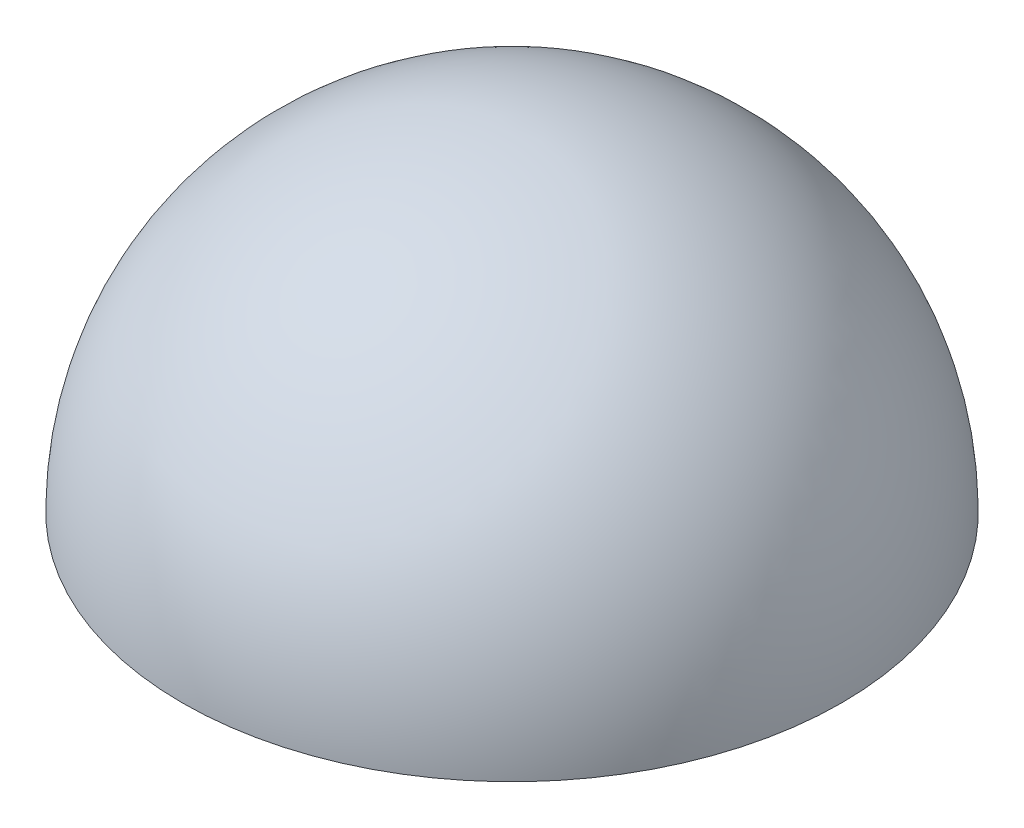
ISO-10303-21;
HEADER;
FILE_DESCRIPTION(('STEP AP214'),'2;1');
FILE_NAME('part.step','',(''),(''),'','','');
FILE_SCHEMA(('AUTOMOTIVE_DESIGN { 1 0 10303 214 1 1 1 1 }'));
ENDSEC;
DATA;
#1=APPLICATION_CONTEXT('core data for automotive mechanical design processes');
#2=APPLICATION_PROTOCOL_DEFINITION('international standard','automotive_design',2000,#1);
#3=PRODUCT_CONTEXT('',#1,'mechanical');
#4=PRODUCT('Part','Part','',(#3));
#5=PRODUCT_RELATED_PRODUCT_CATEGORY('part','',(#4));
#6=PRODUCT_DEFINITION_FORMATION('','',#4);
#7=PRODUCT_DEFINITION_CONTEXT('part definition',#1,'design');
#8=PRODUCT_DEFINITION('design','',#6,#7);
#9=PRODUCT_DEFINITION_SHAPE('','',#8);
#10=(LENGTH_UNIT() NAMED_UNIT(*) SI_UNIT(.MILLI.,.METRE.));
#11=(NAMED_UNIT(*) PLANE_ANGLE_UNIT() SI_UNIT($,.RADIAN.));
#12=(NAMED_UNIT(*) SI_UNIT($,.STERADIAN.) SOLID_ANGLE_UNIT());
#13=UNCERTAINTY_MEASURE_WITH_UNIT(LENGTH_MEASURE(1.E-05),#10,'distance_accuracy_value','');
#14=(GEOMETRIC_REPRESENTATION_CONTEXT(3) GLOBAL_UNCERTAINTY_ASSIGNED_CONTEXT((#13)) GLOBAL_UNIT_ASSIGNED_CONTEXT((#10,
#11,#12)) REPRESENTATION_CONTEXT('',''));
#15=CARTESIAN_POINT('',(0.,0.,0.));
#16=DIRECTION('',(0.,0.,1.));
#17=DIRECTION('',(1.,0.,0.));
#18=AXIS2_PLACEMENT_3D('',#15,#16,#17);
#19=CARTESIAN_POINT('',(0.,0.,0.));
#20=DIRECTION('',(0.,1.,0.));
#21=DIRECTION('',(-1.,0.,0.));
#22=AXIS2_PLACEMENT_3D('',#19,#20,#21);
#23=SPHERICAL_SURFACE('',#22,37.5);
#24=CARTESIAN_POINT('',(0.,0.,0.));
#25=DIRECTION('',(0.,1.,0.));
#26=DIRECTION('',(0.,0.,1.));
#27=AXIS2_PLACEMENT_3D('',#24,#25,#26);
#28=CIRCLE('',#27,37.5);
#29=CARTESIAN_POINT('',(0.,0.,37.5));
#30=VERTEX_POINT('',#29);
#31=EDGE_CURVE('E36',#30,#30,#28,.F.);
#32=ORIENTED_EDGE('',*,*,#31,.T.);
#33=EDGE_LOOP('',(#32));
#34=FACE_BOUND('',#33,.T.);
#35=ADVANCED_FACE('F33',(#34),#23,.F.);
#36=CARTESIAN_POINT('',(0.,0.,0.));
#37=DIRECTION('',(0.,1.,0.));
#38=DIRECTION('',(0.,0.,1.));
#39=AXIS2_PLACEMENT_3D('',#36,#37,#38);
#40=PLANE('',#39);
#41=ORIENTED_EDGE('',*,*,#31,.F.);
#42=EDGE_LOOP('',(#41));
#43=FACE_BOUND('',#42,.T.);
#44=CARTESIAN_POINT('',(0.,0.,0.));
#45=DIRECTION('',(0.,1.,0.));
#46=DIRECTION('',(0.,0.,1.));
#47=AXIS2_PLACEMENT_3D('',#44,#45,#46);
#48=CIRCLE('',#47,40.);
#49=CARTESIAN_POINT('',(0.,0.,40.));
#50=VERTEX_POINT('',#49);
#51=EDGE_CURVE('E10',#50,#50,#48,.T.);
#52=ORIENTED_EDGE('',*,*,#51,.F.);
#53=EDGE_LOOP('',(#52));
#54=FACE_BOUND('',#53,.T.);
#55=ADVANCED_FACE('F46',(#43,#54),#40,.F.);
#56=CARTESIAN_POINT('',(0.,0.,0.));
#57=DIRECTION('',(0.,1.,0.));
#58=DIRECTION('',(-1.,0.,0.));
#59=AXIS2_PLACEMENT_3D('',#56,#57,#58);
#60=SPHERICAL_SURFACE('',#59,40.);
#61=ORIENTED_EDGE('',*,*,#51,.T.);
#62=EDGE_LOOP('',(#61));
#63=FACE_BOUND('',#62,.T.);
#64=ADVANCED_FACE('F49',(#63),#60,.T.);
#65=CLOSED_SHELL('',(#35,#55,#64));
#66=MANIFOLD_SOLID_BREP('B2',#65);
#67=ADVANCED_BREP_SHAPE_REPRESENTATION('',(#18,#66),#14);
#68=SHAPE_DEFINITION_REPRESENTATION(#9,#67);
ENDSEC;
END-ISO-10303-21;
